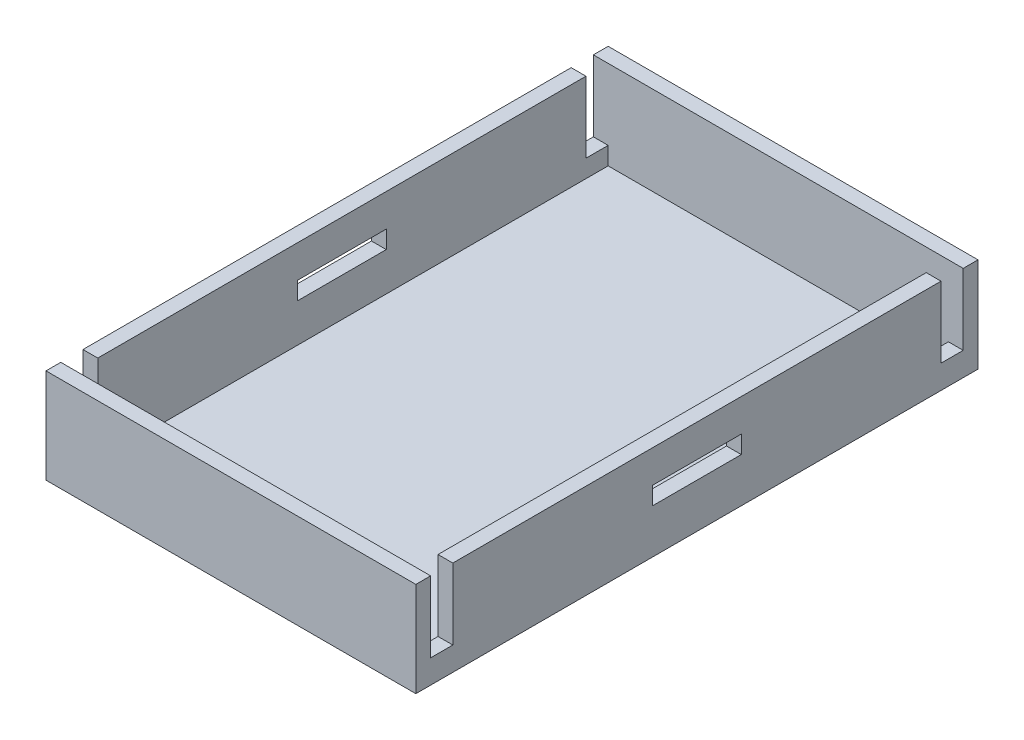
ISO-10303-21;
HEADER;
FILE_DESCRIPTION(('STEP AP214'),'2;1');
FILE_NAME('part.step','',(''),(''),'','','');
FILE_SCHEMA(('AUTOMOTIVE_DESIGN { 1 0 10303 214 1 1 1 1 }'));
ENDSEC;
DATA;
#1=APPLICATION_CONTEXT('core data for automotive mechanical design processes');
#2=APPLICATION_PROTOCOL_DEFINITION('international standard','automotive_design',2000,#1);
#3=PRODUCT_CONTEXT('',#1,'mechanical');
#4=PRODUCT('Part','Part','',(#3));
#5=PRODUCT_RELATED_PRODUCT_CATEGORY('part','',(#4));
#6=PRODUCT_DEFINITION_FORMATION('','',#4);
#7=PRODUCT_DEFINITION_CONTEXT('part definition',#1,'design');
#8=PRODUCT_DEFINITION('design','',#6,#7);
#9=PRODUCT_DEFINITION_SHAPE('','',#8);
#10=(LENGTH_UNIT() NAMED_UNIT(*) SI_UNIT(.MILLI.,.METRE.));
#11=(NAMED_UNIT(*) PLANE_ANGLE_UNIT() SI_UNIT($,.RADIAN.));
#12=(NAMED_UNIT(*) SI_UNIT($,.STERADIAN.) SOLID_ANGLE_UNIT());
#13=UNCERTAINTY_MEASURE_WITH_UNIT(LENGTH_MEASURE(1.E-05),#10,'distance_accuracy_value','');
#14=(GEOMETRIC_REPRESENTATION_CONTEXT(3) GLOBAL_UNCERTAINTY_ASSIGNED_CONTEXT((#13)) GLOBAL_UNIT_ASSIGNED_CONTEXT((#10,
#11,#12)) REPRESENTATION_CONTEXT('',''));
#15=CARTESIAN_POINT('',(0.,0.,0.));
#16=DIRECTION('',(0.,0.,1.));
#17=DIRECTION('',(1.,0.,0.));
#18=AXIS2_PLACEMENT_3D('',#15,#16,#17);
#19=CARTESIAN_POINT('',(12.5,6.4,19.));
#20=DIRECTION('',(-1.,0.,0.));
#21=DIRECTION('',(0.,0.,1.));
#22=AXIS2_PLACEMENT_3D('',#19,#20,#21);
#23=PLANE('',#22);
#24=DIRECTION('',(0.,0.,1.));
#25=VECTOR('',#24,1.);
#26=CARTESIAN_POINT('',(12.5,4.2,3.));
#27=LINE('',#26,#25);
#28=CARTESIAN_POINT('',(12.5,4.2,-3.));
#29=VERTEX_POINT('',#28);
#30=CARTESIAN_POINT('',(12.5,4.2,3.));
#31=VERTEX_POINT('',#30);
#32=EDGE_CURVE('E244',#29,#31,#27,.T.);
#33=ORIENTED_EDGE('',*,*,#32,.F.);
#34=DIRECTION('',(0.,1.,0.));
#35=VECTOR('',#34,1.);
#36=CARTESIAN_POINT('',(12.5,3.,-3.));
#37=LINE('',#36,#35);
#38=CARTESIAN_POINT('',(12.5,3.,-3.));
#39=VERTEX_POINT('',#38);
#40=EDGE_CURVE('E57',#39,#29,#37,.T.);
#41=ORIENTED_EDGE('',*,*,#40,.F.);
#42=DIRECTION('',(0.,0.,-1.));
#43=VECTOR('',#42,1.);
#44=CARTESIAN_POINT('',(12.5,3.,3.));
#45=LINE('',#44,#43);
#46=CARTESIAN_POINT('',(12.5,3.,3.));
#47=VERTEX_POINT('',#46);
#48=EDGE_CURVE('E251',#47,#39,#45,.T.);
#49=ORIENTED_EDGE('',*,*,#48,.F.);
#50=DIRECTION('',(0.,-1.,0.));
#51=VECTOR('',#50,1.);
#52=CARTESIAN_POINT('',(12.5,3.,3.));
#53=LINE('',#52,#51);
#54=EDGE_CURVE('E234',#31,#47,#53,.T.);
#55=ORIENTED_EDGE('',*,*,#54,.F.);
#56=EDGE_LOOP('',(#33,#41,#49,#55));
#57=FACE_BOUND('',#56,.T.);
#58=DIRECTION('',(0.,1.,0.));
#59=VECTOR('',#58,1.);
#60=CARTESIAN_POINT('',(12.5,1.6,-18.));
#61=LINE('',#60,#59);
#62=CARTESIAN_POINT('',(12.5,1.6,-18.));
#63=VERTEX_POINT('',#62);
#64=CARTESIAN_POINT('',(12.5,6.4,-18.));
#65=VERTEX_POINT('',#64);
#66=EDGE_CURVE('E322',#63,#65,#61,.T.);
#67=ORIENTED_EDGE('',*,*,#66,.F.);
#68=DIRECTION('',(0.,0.,-1.));
#69=VECTOR('',#68,1.);
#70=CARTESIAN_POINT('',(12.5,1.6,0.));
#71=LINE('',#70,#69);
#72=CARTESIAN_POINT('',(12.5,1.6,-16.5));
#73=VERTEX_POINT('',#72);
#74=EDGE_CURVE('E316',#73,#63,#71,.T.);
#75=ORIENTED_EDGE('',*,*,#74,.F.);
#76=DIRECTION('',(0.,1.,0.));
#77=VECTOR('',#76,1.);
#78=CARTESIAN_POINT('',(12.5,1.6,-16.5));
#79=LINE('',#78,#77);
#80=CARTESIAN_POINT('',(12.5,6.4,-16.5));
#81=VERTEX_POINT('',#80);
#82=EDGE_CURVE('E326',#73,#81,#79,.T.);
#83=ORIENTED_EDGE('',*,*,#82,.T.);
#84=DIRECTION('',(0.,0.,-1.));
#85=VECTOR('',#84,1.);
#86=CARTESIAN_POINT('',(12.5,6.4,19.));
#87=LINE('',#86,#85);
#88=CARTESIAN_POINT('',(12.5,6.4,16.5));
#89=VERTEX_POINT('',#88);
#90=EDGE_CURVE('E406',#89,#81,#87,.T.);
#91=ORIENTED_EDGE('',*,*,#90,.F.);
#92=DIRECTION('',(0.,1.,0.));
#93=VECTOR('',#92,1.);
#94=CARTESIAN_POINT('',(12.5,1.6,16.5));
#95=LINE('',#94,#93);
#96=CARTESIAN_POINT('',(12.5,1.6,16.5));
#97=VERTEX_POINT('',#96);
#98=EDGE_CURVE('E303',#97,#89,#95,.T.);
#99=ORIENTED_EDGE('',*,*,#98,.F.);
#100=DIRECTION('',(0.,0.,-1.));
#101=VECTOR('',#100,1.);
#102=CARTESIAN_POINT('',(12.5,1.6,0.));
#103=LINE('',#102,#101);
#104=CARTESIAN_POINT('',(12.5,1.6,18.));
#105=VERTEX_POINT('',#104);
#106=EDGE_CURVE('E291',#105,#97,#103,.T.);
#107=ORIENTED_EDGE('',*,*,#106,.F.);
#108=DIRECTION('',(0.,1.,0.));
#109=VECTOR('',#108,1.);
#110=CARTESIAN_POINT('',(12.5,1.6,18.));
#111=LINE('',#110,#109);
#112=CARTESIAN_POINT('',(12.5,6.4,18.));
#113=VERTEX_POINT('',#112);
#114=EDGE_CURVE('E296',#105,#113,#111,.T.);
#115=ORIENTED_EDGE('',*,*,#114,.T.);
#116=CARTESIAN_POINT('',(12.5,6.4,19.));
#117=VERTEX_POINT('',#116);
#118=EDGE_CURVE('E402',#117,#113,#87,.T.);
#119=ORIENTED_EDGE('',*,*,#118,.F.);
#120=DIRECTION('',(0.,-1.,0.));
#121=VECTOR('',#120,1.);
#122=CARTESIAN_POINT('',(12.5,6.4,19.));
#123=LINE('',#122,#121);
#124=CARTESIAN_POINT('',(12.5,0.,19.));
#125=VERTEX_POINT('',#124);
#126=EDGE_CURVE('E416',#117,#125,#123,.T.);
#127=ORIENTED_EDGE('',*,*,#126,.T.);
#128=DIRECTION('',(0.,0.,-1.));
#129=VECTOR('',#128,1.);
#130=CARTESIAN_POINT('',(12.5,0.,19.));
#131=LINE('',#130,#129);
#132=CARTESIAN_POINT('',(12.5,0.,-19.));
#133=VERTEX_POINT('',#132);
#134=EDGE_CURVE('E393',#125,#133,#131,.T.);
#135=ORIENTED_EDGE('',*,*,#134,.T.);
#136=DIRECTION('',(0.,-1.,0.));
#137=VECTOR('',#136,1.);
#138=CARTESIAN_POINT('',(12.5,6.4,-19.));
#139=LINE('',#138,#137);
#140=CARTESIAN_POINT('',(12.5,6.4,-19.));
#141=VERTEX_POINT('',#140);
#142=EDGE_CURVE('E433',#141,#133,#139,.T.);
#143=ORIENTED_EDGE('',*,*,#142,.F.);
#144=EDGE_CURVE('E407',#65,#141,#87,.T.);
#145=ORIENTED_EDGE('',*,*,#144,.F.);
#146=EDGE_LOOP('',(#67,#75,#83,#91,#99,#107,#115,#119,#127,#135,#143,#145));
#147=FACE_BOUND('',#146,.T.);
#148=ADVANCED_FACE('F43',(#57,#147),#23,.F.);
#149=CARTESIAN_POINT('',(-12.5,6.4,19.));
#150=DIRECTION('',(1.,0.,0.));
#151=DIRECTION('',(0.,0.,-1.));
#152=AXIS2_PLACEMENT_3D('',#149,#150,#151);
#153=PLANE('',#152);
#154=DIRECTION('',(0.,0.,-1.));
#155=VECTOR('',#154,1.);
#156=CARTESIAN_POINT('',(-12.5,3.,3.));
#157=LINE('',#156,#155);
#158=CARTESIAN_POINT('',(-12.5,3.,3.));
#159=VERTEX_POINT('',#158);
#160=CARTESIAN_POINT('',(-12.5,3.,-3.));
#161=VERTEX_POINT('',#160);
#162=EDGE_CURVE('E263',#159,#161,#157,.T.);
#163=ORIENTED_EDGE('',*,*,#162,.T.);
#164=DIRECTION('',(0.,1.,0.));
#165=VECTOR('',#164,1.);
#166=CARTESIAN_POINT('',(-12.5,3.,-3.));
#167=LINE('',#166,#165);
#168=CARTESIAN_POINT('',(-12.5,4.2,-3.));
#169=VERTEX_POINT('',#168);
#170=EDGE_CURVE('E253',#161,#169,#167,.T.);
#171=ORIENTED_EDGE('',*,*,#170,.T.);
#172=DIRECTION('',(0.,0.,1.));
#173=VECTOR('',#172,1.);
#174=CARTESIAN_POINT('',(-12.5,4.2,3.));
#175=LINE('',#174,#173);
#176=CARTESIAN_POINT('',(-12.5,4.2,3.));
#177=VERTEX_POINT('',#176);
#178=EDGE_CURVE('E259',#169,#177,#175,.T.);
#179=ORIENTED_EDGE('',*,*,#178,.T.);
#180=DIRECTION('',(0.,-1.,0.));
#181=VECTOR('',#180,1.);
#182=CARTESIAN_POINT('',(-12.5,3.,3.));
#183=LINE('',#182,#181);
#184=EDGE_CURVE('E65',#177,#159,#183,.T.);
#185=ORIENTED_EDGE('',*,*,#184,.T.);
#186=EDGE_LOOP('',(#163,#171,#179,#185));
#187=FACE_BOUND('',#186,.T.);
#188=DIRECTION('',(0.,1.,0.));
#189=VECTOR('',#188,1.);
#190=CARTESIAN_POINT('',(-12.5,1.6,18.));
#191=LINE('',#190,#189);
#192=CARTESIAN_POINT('',(-12.5,1.6,18.));
#193=VERTEX_POINT('',#192);
#194=CARTESIAN_POINT('',(-12.5,6.4,18.));
#195=VERTEX_POINT('',#194);
#196=EDGE_CURVE('E321',#193,#195,#191,.T.);
#197=ORIENTED_EDGE('',*,*,#196,.F.);
#198=DIRECTION('',(0.,0.,1.));
#199=VECTOR('',#198,1.);
#200=CARTESIAN_POINT('',(-12.5,1.6,0.));
#201=LINE('',#200,#199);
#202=CARTESIAN_POINT('',(-12.5,1.6,16.5));
#203=VERTEX_POINT('',#202);
#204=EDGE_CURVE('E338',#203,#193,#201,.T.);
#205=ORIENTED_EDGE('',*,*,#204,.F.);
#206=DIRECTION('',(0.,1.,0.));
#207=VECTOR('',#206,1.);
#208=CARTESIAN_POINT('',(-12.5,1.6,16.5));
#209=LINE('',#208,#207);
#210=CARTESIAN_POINT('',(-12.5,6.4,16.5));
#211=VERTEX_POINT('',#210);
#212=EDGE_CURVE('E345',#203,#211,#209,.T.);
#213=ORIENTED_EDGE('',*,*,#212,.T.);
#214=DIRECTION('',(0.,0.,1.));
#215=VECTOR('',#214,1.);
#216=CARTESIAN_POINT('',(-12.5,6.4,19.));
#217=LINE('',#216,#215);
#218=CARTESIAN_POINT('',(-12.5,6.4,-16.5));
#219=VERTEX_POINT('',#218);
#220=EDGE_CURVE('E414',#219,#211,#217,.T.);
#221=ORIENTED_EDGE('',*,*,#220,.F.);
#222=DIRECTION('',(0.,1.,0.));
#223=VECTOR('',#222,1.);
#224=CARTESIAN_POINT('',(-12.5,1.6,-16.5));
#225=LINE('',#224,#223);
#226=CARTESIAN_POINT('',(-12.5,1.6,-16.5));
#227=VERTEX_POINT('',#226);
#228=EDGE_CURVE('E362',#227,#219,#225,.T.);
#229=ORIENTED_EDGE('',*,*,#228,.F.);
#230=DIRECTION('',(0.,0.,1.));
#231=VECTOR('',#230,1.);
#232=CARTESIAN_POINT('',(-12.5,1.6,0.));
#233=LINE('',#232,#231);
#234=CARTESIAN_POINT('',(-12.5,1.6,-18.));
#235=VERTEX_POINT('',#234);
#236=EDGE_CURVE('E356',#235,#227,#233,.T.);
#237=ORIENTED_EDGE('',*,*,#236,.F.);
#238=DIRECTION('',(0.,1.,0.));
#239=VECTOR('',#238,1.);
#240=CARTESIAN_POINT('',(-12.5,1.6,-18.));
#241=LINE('',#240,#239);
#242=CARTESIAN_POINT('',(-12.5,6.4,-18.));
#243=VERTEX_POINT('',#242);
#244=EDGE_CURVE('E365',#235,#243,#241,.T.);
#245=ORIENTED_EDGE('',*,*,#244,.T.);
#246=CARTESIAN_POINT('',(-12.5,6.4,-19.));
#247=VERTEX_POINT('',#246);
#248=EDGE_CURVE('E410',#247,#243,#217,.T.);
#249=ORIENTED_EDGE('',*,*,#248,.F.);
#250=DIRECTION('',(0.,-1.,0.));
#251=VECTOR('',#250,1.);
#252=CARTESIAN_POINT('',(-12.5,6.4,-19.));
#253=LINE('',#252,#251);
#254=CARTESIAN_POINT('',(-12.5,0.,-19.));
#255=VERTEX_POINT('',#254);
#256=EDGE_CURVE('E430',#247,#255,#253,.T.);
#257=ORIENTED_EDGE('',*,*,#256,.T.);
#258=DIRECTION('',(0.,0.,1.));
#259=VECTOR('',#258,1.);
#260=CARTESIAN_POINT('',(-12.5,0.,19.));
#261=LINE('',#260,#259);
#262=CARTESIAN_POINT('',(-12.5,0.,19.));
#263=VERTEX_POINT('',#262);
#264=EDGE_CURVE('E421',#255,#263,#261,.T.);
#265=ORIENTED_EDGE('',*,*,#264,.T.);
#266=DIRECTION('',(0.,-1.,0.));
#267=VECTOR('',#266,1.);
#268=CARTESIAN_POINT('',(-12.5,6.4,19.));
#269=LINE('',#268,#267);
#270=CARTESIAN_POINT('',(-12.5,6.4,19.));
#271=VERTEX_POINT('',#270);
#272=EDGE_CURVE('E427',#271,#263,#269,.T.);
#273=ORIENTED_EDGE('',*,*,#272,.F.);
#274=EDGE_CURVE('E409',#195,#271,#217,.T.);
#275=ORIENTED_EDGE('',*,*,#274,.F.);
#276=EDGE_LOOP('',(#197,#205,#213,#221,#229,#237,#245,#249,#257,#265,#273,#275));
#277=FACE_BOUND('',#276,.T.);
#278=ADVANCED_FACE('F459',(#187,#277),#153,.F.);
#279=CARTESIAN_POINT('',(0.,6.4,0.));
#280=DIRECTION('',(0.,-1.,0.));
#281=DIRECTION('',(0.,0.,-1.));
#282=AXIS2_PLACEMENT_3D('',#279,#280,#281);
#283=PLANE('',#282);
#284=DIRECTION('',(1.,0.,0.));
#285=VECTOR('',#284,1.);
#286=CARTESIAN_POINT('',(0.,6.4,-18.));
#287=LINE('',#286,#285);
#288=EDGE_CURVE('E386',#243,#65,#287,.T.);
#289=ORIENTED_EDGE('',*,*,#288,.T.);
#290=ORIENTED_EDGE('',*,*,#144,.T.);
#291=DIRECTION('',(-1.,0.,0.));
#292=VECTOR('',#291,1.);
#293=CARTESIAN_POINT('',(-12.5,6.4,-19.));
#294=LINE('',#293,#292);
#295=EDGE_CURVE('E405',#141,#247,#294,.T.);
#296=ORIENTED_EDGE('',*,*,#295,.T.);
#297=ORIENTED_EDGE('',*,*,#248,.T.);
#298=EDGE_LOOP('',(#289,#290,#296,#297));
#299=FACE_BOUND('',#298,.T.);
#300=ADVANCED_FACE('F464',(#299),#283,.F.);
#301=DIRECTION('',(1.,0.,0.));
#302=VECTOR('',#301,1.);
#303=CARTESIAN_POINT('',(0.,6.4,18.));
#304=LINE('',#303,#302);
#305=EDGE_CURVE('E364',#195,#113,#304,.T.);
#306=ORIENTED_EDGE('',*,*,#305,.F.);
#307=ORIENTED_EDGE('',*,*,#274,.T.);
#308=DIRECTION('',(1.,0.,0.));
#309=VECTOR('',#308,1.);
#310=CARTESIAN_POINT('',(-12.5,6.4,19.));
#311=LINE('',#310,#309);
#312=EDGE_CURVE('E413',#271,#117,#311,.T.);
#313=ORIENTED_EDGE('',*,*,#312,.T.);
#314=ORIENTED_EDGE('',*,*,#118,.T.);
#315=EDGE_LOOP('',(#306,#307,#313,#314));
#316=FACE_BOUND('',#315,.T.);
#317=ADVANCED_FACE('F471',(#316),#283,.F.);
#318=ORIENTED_EDGE('',*,*,#90,.T.);
#319=DIRECTION('',(1.,0.,0.));
#320=VECTOR('',#319,1.);
#321=CARTESIAN_POINT('',(0.,6.4,-16.5));
#322=LINE('',#321,#320);
#323=CARTESIAN_POINT('',(11.5,6.4,-16.5));
#324=VERTEX_POINT('',#323);
#325=EDGE_CURVE('E310',#324,#81,#322,.T.);
#326=ORIENTED_EDGE('',*,*,#325,.F.);
#327=DIRECTION('',(0.,0.,-1.));
#328=VECTOR('',#327,1.);
#329=CARTESIAN_POINT('',(11.5,6.4,0.));
#330=LINE('',#329,#328);
#331=CARTESIAN_POINT('',(11.5,6.4,16.5));
#332=VERTEX_POINT('',#331);
#333=EDGE_CURVE('E383',#332,#324,#330,.T.);
#334=ORIENTED_EDGE('',*,*,#333,.F.);
#335=DIRECTION('',(1.,0.,0.));
#336=VECTOR('',#335,1.);
#337=CARTESIAN_POINT('',(0.,6.4,16.5));
#338=LINE('',#337,#336);
#339=EDGE_CURVE('E284',#332,#89,#338,.T.);
#340=ORIENTED_EDGE('',*,*,#339,.T.);
#341=EDGE_LOOP('',(#318,#326,#334,#340));
#342=FACE_BOUND('',#341,.T.);
#343=ADVANCED_FACE('F536',(#342),#283,.F.);
#344=ORIENTED_EDGE('',*,*,#220,.T.);
#345=DIRECTION('',(-1.,0.,0.));
#346=VECTOR('',#345,1.);
#347=CARTESIAN_POINT('',(0.,6.4,16.5));
#348=LINE('',#347,#346);
#349=CARTESIAN_POINT('',(-11.5,6.4,16.5));
#350=VERTEX_POINT('',#349);
#351=EDGE_CURVE('E302',#350,#211,#348,.T.);
#352=ORIENTED_EDGE('',*,*,#351,.F.);
#353=DIRECTION('',(0.,0.,-1.));
#354=VECTOR('',#353,1.);
#355=CARTESIAN_POINT('',(-11.5,6.4,0.));
#356=LINE('',#355,#354);
#357=CARTESIAN_POINT('',(-11.5,6.4,-16.5));
#358=VERTEX_POINT('',#357);
#359=EDGE_CURVE('E374',#350,#358,#356,.T.);
#360=ORIENTED_EDGE('',*,*,#359,.T.);
#361=DIRECTION('',(-1.,0.,0.));
#362=VECTOR('',#361,1.);
#363=CARTESIAN_POINT('',(0.,6.4,-16.5));
#364=LINE('',#363,#362);
#365=EDGE_CURVE('E325',#358,#219,#364,.T.);
#366=ORIENTED_EDGE('',*,*,#365,.T.);
#367=EDGE_LOOP('',(#344,#352,#360,#366));
#368=FACE_BOUND('',#367,.T.);
#369=ADVANCED_FACE('F474',(#368),#283,.F.);
#370=CARTESIAN_POINT('',(-11.5,0.4,0.));
#371=DIRECTION('',(1.,0.,0.));
#372=DIRECTION('',(0.,0.,-1.));
#373=AXIS2_PLACEMENT_3D('',#370,#371,#372);
#374=PLANE('',#373);
#375=DIRECTION('',(0.,1.,0.));
#376=VECTOR('',#375,1.);
#377=CARTESIAN_POINT('',(-11.5,0.4,-3.));
#378=LINE('',#377,#376);
#379=CARTESIAN_POINT('',(-11.5,3.,-3.));
#380=VERTEX_POINT('',#379);
#381=CARTESIAN_POINT('',(-11.5,4.2,-3.));
#382=VERTEX_POINT('',#381);
#383=EDGE_CURVE('E281',#380,#382,#378,.T.);
#384=ORIENTED_EDGE('',*,*,#383,.F.);
#385=DIRECTION('',(0.,0.,-1.));
#386=VECTOR('',#385,1.);
#387=CARTESIAN_POINT('',(-11.5,3.,0.));
#388=LINE('',#387,#386);
#389=CARTESIAN_POINT('',(-11.5,3.,3.));
#390=VERTEX_POINT('',#389);
#391=EDGE_CURVE('E279',#390,#380,#388,.T.);
#392=ORIENTED_EDGE('',*,*,#391,.F.);
#393=DIRECTION('',(0.,-1.,0.));
#394=VECTOR('',#393,1.);
#395=CARTESIAN_POINT('',(-11.5,0.399999999999999,3.));
#396=LINE('',#395,#394);
#397=CARTESIAN_POINT('',(-11.5,4.2,3.));
#398=VERTEX_POINT('',#397);
#399=EDGE_CURVE('E277',#398,#390,#396,.T.);
#400=ORIENTED_EDGE('',*,*,#399,.F.);
#401=DIRECTION('',(0.,0.,1.));
#402=VECTOR('',#401,1.);
#403=CARTESIAN_POINT('',(-11.5,4.2,0.));
#404=LINE('',#403,#402);
#405=EDGE_CURVE('E269',#382,#398,#404,.T.);
#406=ORIENTED_EDGE('',*,*,#405,.F.);
#407=EDGE_LOOP('',(#384,#392,#400,#406));
#408=FACE_BOUND('',#407,.T.);
#409=DIRECTION('',(0.,1.,0.));
#410=VECTOR('',#409,1.);
#411=CARTESIAN_POINT('',(-11.5,1.6,16.5));
#412=LINE('',#411,#410);
#413=CARTESIAN_POINT('',(-11.5,1.6,16.5));
#414=VERTEX_POINT('',#413);
#415=EDGE_CURVE('E341',#414,#350,#412,.T.);
#416=ORIENTED_EDGE('',*,*,#415,.F.);
#417=DIRECTION('',(0.,0.,-1.));
#418=VECTOR('',#417,1.);
#419=CARTESIAN_POINT('',(-11.5,1.6,0.));
#420=LINE('',#419,#418);
#421=CARTESIAN_POINT('',(-11.5,1.6,18.));
#422=VERTEX_POINT('',#421);
#423=EDGE_CURVE('E332',#422,#414,#420,.T.);
#424=ORIENTED_EDGE('',*,*,#423,.F.);
#425=DIRECTION('',(0.,1.,0.));
#426=VECTOR('',#425,1.);
#427=CARTESIAN_POINT('',(-11.5,0.4,18.));
#428=LINE('',#427,#426);
#429=CARTESIAN_POINT('',(-11.5,0.4,18.));
#430=VERTEX_POINT('',#429);
#431=EDGE_CURVE('E390',#430,#422,#428,.T.);
#432=ORIENTED_EDGE('',*,*,#431,.F.);
#433=DIRECTION('',(0.,0.,-1.));
#434=VECTOR('',#433,1.);
#435=CARTESIAN_POINT('',(-11.5,0.4,0.));
#436=LINE('',#435,#434);
#437=CARTESIAN_POINT('',(-11.5,0.4,-18.));
#438=VERTEX_POINT('',#437);
#439=EDGE_CURVE('E379',#430,#438,#436,.T.);
#440=ORIENTED_EDGE('',*,*,#439,.T.);
#441=DIRECTION('',(0.,1.,0.));
#442=VECTOR('',#441,1.);
#443=CARTESIAN_POINT('',(-11.5,0.4,-18.));
#444=LINE('',#443,#442);
#445=CARTESIAN_POINT('',(-11.5,1.6,-18.));
#446=VERTEX_POINT('',#445);
#447=EDGE_CURVE('E394',#438,#446,#444,.T.);
#448=ORIENTED_EDGE('',*,*,#447,.T.);
#449=DIRECTION('',(0.,0.,-1.));
#450=VECTOR('',#449,1.);
#451=CARTESIAN_POINT('',(-11.5,1.6,0.));
#452=LINE('',#451,#450);
#453=CARTESIAN_POINT('',(-11.5,1.6,-16.5));
#454=VERTEX_POINT('',#453);
#455=EDGE_CURVE('E351',#454,#446,#452,.T.);
#456=ORIENTED_EDGE('',*,*,#455,.F.);
#457=DIRECTION('',(0.,1.,0.));
#458=VECTOR('',#457,1.);
#459=CARTESIAN_POINT('',(-11.5,1.6,-16.5));
#460=LINE('',#459,#458);
#461=EDGE_CURVE('E359',#454,#358,#460,.T.);
#462=ORIENTED_EDGE('',*,*,#461,.T.);
#463=ORIENTED_EDGE('',*,*,#359,.F.);
#464=EDGE_LOOP('',(#416,#424,#432,#440,#448,#456,#462,#463));
#465=FACE_BOUND('',#464,.T.);
#466=ADVANCED_FACE('F488',(#408,#465),#374,.T.);
#467=CARTESIAN_POINT('',(11.5,0.4,0.));
#468=DIRECTION('',(1.,0.,0.));
#469=DIRECTION('',(0.,0.,-1.));
#470=AXIS2_PLACEMENT_3D('',#467,#468,#469);
#471=PLANE('',#470);
#472=DIRECTION('',(0.,0.,-1.));
#473=VECTOR('',#472,1.);
#474=CARTESIAN_POINT('',(11.5,3.,0.));
#475=LINE('',#474,#473);
#476=CARTESIAN_POINT('',(11.5,3.,3.));
#477=VERTEX_POINT('',#476);
#478=CARTESIAN_POINT('',(11.5,3.,-3.));
#479=VERTEX_POINT('',#478);
#480=EDGE_CURVE('E50',#477,#479,#475,.T.);
#481=ORIENTED_EDGE('',*,*,#480,.T.);
#482=DIRECTION('',(0.,1.,0.));
#483=VECTOR('',#482,1.);
#484=CARTESIAN_POINT('',(11.5,0.4,-3.));
#485=LINE('',#484,#483);
#486=CARTESIAN_POINT('',(11.5,4.2,-3.));
#487=VERTEX_POINT('',#486);
#488=EDGE_CURVE('E11',#479,#487,#485,.T.);
#489=ORIENTED_EDGE('',*,*,#488,.T.);
#490=DIRECTION('',(0.,0.,1.));
#491=VECTOR('',#490,1.);
#492=CARTESIAN_POINT('',(11.5,4.2,0.));
#493=LINE('',#492,#491);
#494=CARTESIAN_POINT('',(11.5,4.2,3.));
#495=VERTEX_POINT('',#494);
#496=EDGE_CURVE('E436',#487,#495,#493,.T.);
#497=ORIENTED_EDGE('',*,*,#496,.T.);
#498=DIRECTION('',(0.,-1.,0.));
#499=VECTOR('',#498,1.);
#500=CARTESIAN_POINT('',(11.5,0.399999999999999,3.));
#501=LINE('',#500,#499);
#502=EDGE_CURVE('E237',#495,#477,#501,.T.);
#503=ORIENTED_EDGE('',*,*,#502,.T.);
#504=EDGE_LOOP('',(#481,#489,#497,#503));
#505=FACE_BOUND('',#504,.T.);
#506=ORIENTED_EDGE('',*,*,#333,.T.);
#507=DIRECTION('',(0.,1.,0.));
#508=VECTOR('',#507,1.);
#509=CARTESIAN_POINT('',(11.5,1.6,-16.5));
#510=LINE('',#509,#508);
#511=CARTESIAN_POINT('',(11.5,1.6,-16.5));
#512=VERTEX_POINT('',#511);
#513=EDGE_CURVE('E319',#512,#324,#510,.T.);
#514=ORIENTED_EDGE('',*,*,#513,.F.);
#515=DIRECTION('',(0.,0.,-1.));
#516=VECTOR('',#515,1.);
#517=CARTESIAN_POINT('',(11.5,1.6,0.));
#518=LINE('',#517,#516);
#519=CARTESIAN_POINT('',(11.5,1.6,-18.));
#520=VERTEX_POINT('',#519);
#521=EDGE_CURVE('E309',#512,#520,#518,.T.);
#522=ORIENTED_EDGE('',*,*,#521,.T.);
#523=DIRECTION('',(0.,1.,0.));
#524=VECTOR('',#523,1.);
#525=CARTESIAN_POINT('',(11.5,0.4,-18.));
#526=LINE('',#525,#524);
#527=CARTESIAN_POINT('',(11.5,0.4,-18.));
#528=VERTEX_POINT('',#527);
#529=EDGE_CURVE('E397',#528,#520,#526,.T.);
#530=ORIENTED_EDGE('',*,*,#529,.F.);
#531=DIRECTION('',(0.,0.,-1.));
#532=VECTOR('',#531,1.);
#533=CARTESIAN_POINT('',(11.5,0.4,0.));
#534=LINE('',#533,#532);
#535=CARTESIAN_POINT('',(11.5,0.4,18.));
#536=VERTEX_POINT('',#535);
#537=EDGE_CURVE('E373',#536,#528,#534,.T.);
#538=ORIENTED_EDGE('',*,*,#537,.F.);
#539=DIRECTION('',(0.,1.,0.));
#540=VECTOR('',#539,1.);
#541=CARTESIAN_POINT('',(11.5,0.4,18.));
#542=LINE('',#541,#540);
#543=CARTESIAN_POINT('',(11.5,1.6,18.));
#544=VERTEX_POINT('',#543);
#545=EDGE_CURVE('E381',#536,#544,#542,.T.);
#546=ORIENTED_EDGE('',*,*,#545,.T.);
#547=DIRECTION('',(0.,0.,-1.));
#548=VECTOR('',#547,1.);
#549=CARTESIAN_POINT('',(11.5,1.6,0.));
#550=LINE('',#549,#548);
#551=CARTESIAN_POINT('',(11.5,1.6,16.5));
#552=VERTEX_POINT('',#551);
#553=EDGE_CURVE('E285',#544,#552,#550,.T.);
#554=ORIENTED_EDGE('',*,*,#553,.T.);
#555=DIRECTION('',(0.,1.,0.));
#556=VECTOR('',#555,1.);
#557=CARTESIAN_POINT('',(11.5,1.6,16.5));
#558=LINE('',#557,#556);
#559=EDGE_CURVE('E299',#552,#332,#558,.T.);
#560=ORIENTED_EDGE('',*,*,#559,.T.);
#561=EDGE_LOOP('',(#506,#514,#522,#530,#538,#546,#554,#560));
#562=FACE_BOUND('',#561,.T.);
#563=ADVANCED_FACE('F440',(#505,#562),#471,.F.);
#564=CARTESIAN_POINT('',(-12.5,6.4,-19.));
#565=DIRECTION('',(0.,0.,1.));
#566=DIRECTION('',(1.,0.,0.));
#567=AXIS2_PLACEMENT_3D('',#564,#565,#566);
#568=PLANE('',#567);
#569=DIRECTION('',(-1.,0.,0.));
#570=VECTOR('',#569,1.);
#571=CARTESIAN_POINT('',(-12.5,0.,-19.));
#572=LINE('',#571,#570);
#573=EDGE_CURVE('E419',#133,#255,#572,.T.);
#574=ORIENTED_EDGE('',*,*,#573,.T.);
#575=ORIENTED_EDGE('',*,*,#256,.F.);
#576=ORIENTED_EDGE('',*,*,#295,.F.);
#577=ORIENTED_EDGE('',*,*,#142,.T.);
#578=EDGE_LOOP('',(#574,#575,#576,#577));
#579=FACE_BOUND('',#578,.T.);
#580=ADVANCED_FACE('F479',(#579),#568,.F.);
#581=CARTESIAN_POINT('',(-12.5,6.4,19.));
#582=DIRECTION('',(0.,0.,-1.));
#583=DIRECTION('',(-1.,0.,0.));
#584=AXIS2_PLACEMENT_3D('',#581,#582,#583);
#585=PLANE('',#584);
#586=DIRECTION('',(1.,0.,0.));
#587=VECTOR('',#586,1.);
#588=CARTESIAN_POINT('',(-12.5,0.,19.));
#589=LINE('',#588,#587);
#590=EDGE_CURVE('E423',#263,#125,#589,.T.);
#591=ORIENTED_EDGE('',*,*,#590,.T.);
#592=ORIENTED_EDGE('',*,*,#126,.F.);
#593=ORIENTED_EDGE('',*,*,#312,.F.);
#594=ORIENTED_EDGE('',*,*,#272,.T.);
#595=EDGE_LOOP('',(#591,#592,#593,#594));
#596=FACE_BOUND('',#595,.T.);
#597=ADVANCED_FACE('F477',(#596),#585,.F.);
#598=CARTESIAN_POINT('',(0.,0.,0.));
#599=DIRECTION('',(0.,-1.,0.));
#600=DIRECTION('',(0.,0.,-1.));
#601=AXIS2_PLACEMENT_3D('',#598,#599,#600);
#602=PLANE('',#601);
#603=ORIENTED_EDGE('',*,*,#134,.F.);
#604=ORIENTED_EDGE('',*,*,#590,.F.);
#605=ORIENTED_EDGE('',*,*,#264,.F.);
#606=ORIENTED_EDGE('',*,*,#573,.F.);
#607=EDGE_LOOP('',(#603,#604,#605,#606));
#608=FACE_BOUND('',#607,.T.);
#609=ADVANCED_FACE('F485',(#608),#602,.T.);
#610=CARTESIAN_POINT('',(0.,0.4,18.));
#611=DIRECTION('',(0.,0.,1.));
#612=DIRECTION('',(1.,0.,0.));
#613=AXIS2_PLACEMENT_3D('',#610,#611,#612);
#614=PLANE('',#613);
#615=ORIENTED_EDGE('',*,*,#305,.T.);
#616=ORIENTED_EDGE('',*,*,#114,.F.);
#617=DIRECTION('',(1.,0.,0.));
#618=VECTOR('',#617,1.);
#619=CARTESIAN_POINT('',(0.,1.6,18.));
#620=LINE('',#619,#618);
#621=EDGE_CURVE('E288',#544,#105,#620,.T.);
#622=ORIENTED_EDGE('',*,*,#621,.F.);
#623=ORIENTED_EDGE('',*,*,#545,.F.);
#624=DIRECTION('',(1.,0.,0.));
#625=VECTOR('',#624,1.);
#626=CARTESIAN_POINT('',(0.,0.4,18.));
#627=LINE('',#626,#625);
#628=EDGE_CURVE('E370',#430,#536,#627,.T.);
#629=ORIENTED_EDGE('',*,*,#628,.F.);
#630=ORIENTED_EDGE('',*,*,#431,.T.);
#631=DIRECTION('',(-1.,0.,0.));
#632=VECTOR('',#631,1.);
#633=CARTESIAN_POINT('',(0.,1.6,18.));
#634=LINE('',#633,#632);
#635=EDGE_CURVE('E330',#422,#193,#634,.T.);
#636=ORIENTED_EDGE('',*,*,#635,.T.);
#637=ORIENTED_EDGE('',*,*,#196,.T.);
#638=EDGE_LOOP('',(#615,#616,#622,#623,#629,#630,#636,#637));
#639=FACE_BOUND('',#638,.T.);
#640=ADVANCED_FACE('F556',(#639),#614,.F.);
#641=CARTESIAN_POINT('',(0.,0.4,-18.));
#642=DIRECTION('',(0.,0.,1.));
#643=DIRECTION('',(1.,0.,0.));
#644=AXIS2_PLACEMENT_3D('',#641,#642,#643);
#645=PLANE('',#644);
#646=ORIENTED_EDGE('',*,*,#288,.F.);
#647=ORIENTED_EDGE('',*,*,#244,.F.);
#648=DIRECTION('',(-1.,0.,0.));
#649=VECTOR('',#648,1.);
#650=CARTESIAN_POINT('',(0.,1.6,-18.));
#651=LINE('',#650,#649);
#652=EDGE_CURVE('E353',#446,#235,#651,.T.);
#653=ORIENTED_EDGE('',*,*,#652,.F.);
#654=ORIENTED_EDGE('',*,*,#447,.F.);
#655=DIRECTION('',(1.,0.,0.));
#656=VECTOR('',#655,1.);
#657=CARTESIAN_POINT('',(0.,0.4,-18.));
#658=LINE('',#657,#656);
#659=EDGE_CURVE('E377',#438,#528,#658,.T.);
#660=ORIENTED_EDGE('',*,*,#659,.T.);
#661=ORIENTED_EDGE('',*,*,#529,.T.);
#662=DIRECTION('',(1.,0.,0.));
#663=VECTOR('',#662,1.);
#664=CARTESIAN_POINT('',(0.,1.6,-18.));
#665=LINE('',#664,#663);
#666=EDGE_CURVE('E307',#520,#63,#665,.T.);
#667=ORIENTED_EDGE('',*,*,#666,.T.);
#668=ORIENTED_EDGE('',*,*,#66,.T.);
#669=EDGE_LOOP('',(#646,#647,#653,#654,#660,#661,#667,#668));
#670=FACE_BOUND('',#669,.T.);
#671=ADVANCED_FACE('F547',(#670),#645,.T.);
#672=CARTESIAN_POINT('',(0.,0.4,0.));
#673=DIRECTION('',(0.,1.,0.));
#674=DIRECTION('',(0.,0.,1.));
#675=AXIS2_PLACEMENT_3D('',#672,#673,#674);
#676=PLANE('',#675);
#677=ORIENTED_EDGE('',*,*,#628,.T.);
#678=ORIENTED_EDGE('',*,*,#537,.T.);
#679=ORIENTED_EDGE('',*,*,#659,.F.);
#680=ORIENTED_EDGE('',*,*,#439,.F.);
#681=EDGE_LOOP('',(#677,#678,#679,#680));
#682=FACE_BOUND('',#681,.T.);
#683=ADVANCED_FACE('F552',(#682),#676,.T.);
#684=CARTESIAN_POINT('',(0.,1.6,16.5));
#685=DIRECTION('',(0.,0.,1.));
#686=DIRECTION('',(1.,0.,0.));
#687=AXIS2_PLACEMENT_3D('',#684,#685,#686);
#688=PLANE('',#687);
#689=ORIENTED_EDGE('',*,*,#339,.F.);
#690=ORIENTED_EDGE('',*,*,#559,.F.);
#691=DIRECTION('',(1.,0.,0.));
#692=VECTOR('',#691,1.);
#693=CARTESIAN_POINT('',(0.,1.6,16.5));
#694=LINE('',#693,#692);
#695=EDGE_CURVE('E294',#552,#97,#694,.T.);
#696=ORIENTED_EDGE('',*,*,#695,.T.);
#697=ORIENTED_EDGE('',*,*,#98,.T.);
#698=EDGE_LOOP('',(#689,#690,#696,#697));
#699=FACE_BOUND('',#698,.T.);
#700=ADVANCED_FACE('F561',(#699),#688,.T.);
#701=CARTESIAN_POINT('',(0.,1.6,0.));
#702=DIRECTION('',(0.,1.,0.));
#703=DIRECTION('',(0.,0.,1.));
#704=AXIS2_PLACEMENT_3D('',#701,#702,#703);
#705=PLANE('',#704);
#706=ORIENTED_EDGE('',*,*,#553,.F.);
#707=ORIENTED_EDGE('',*,*,#621,.T.);
#708=ORIENTED_EDGE('',*,*,#106,.T.);
#709=ORIENTED_EDGE('',*,*,#695,.F.);
#710=EDGE_LOOP('',(#706,#707,#708,#709));
#711=FACE_BOUND('',#710,.T.);
#712=ADVANCED_FACE('F558',(#711),#705,.T.);
#713=CARTESIAN_POINT('',(0.,1.6,-16.5));
#714=DIRECTION('',(0.,0.,1.));
#715=DIRECTION('',(1.,0.,0.));
#716=AXIS2_PLACEMENT_3D('',#713,#714,#715);
#717=PLANE('',#716);
#718=ORIENTED_EDGE('',*,*,#325,.T.);
#719=ORIENTED_EDGE('',*,*,#82,.F.);
#720=DIRECTION('',(1.,0.,0.));
#721=VECTOR('',#720,1.);
#722=CARTESIAN_POINT('',(0.,1.6,-16.5));
#723=LINE('',#722,#721);
#724=EDGE_CURVE('E313',#512,#73,#723,.T.);
#725=ORIENTED_EDGE('',*,*,#724,.F.);
#726=ORIENTED_EDGE('',*,*,#513,.T.);
#727=EDGE_LOOP('',(#718,#719,#725,#726));
#728=FACE_BOUND('',#727,.T.);
#729=ADVANCED_FACE('F541',(#728),#717,.F.);
#730=CARTESIAN_POINT('',(0.,1.6,0.));
#731=DIRECTION('',(0.,1.,0.));
#732=DIRECTION('',(0.,0.,1.));
#733=AXIS2_PLACEMENT_3D('',#730,#731,#732);
#734=PLANE('',#733);
#735=ORIENTED_EDGE('',*,*,#666,.F.);
#736=ORIENTED_EDGE('',*,*,#521,.F.);
#737=ORIENTED_EDGE('',*,*,#724,.T.);
#738=ORIENTED_EDGE('',*,*,#74,.T.);
#739=EDGE_LOOP('',(#735,#736,#737,#738));
#740=FACE_BOUND('',#739,.T.);
#741=ADVANCED_FACE('F544',(#740),#734,.T.);
#742=CARTESIAN_POINT('',(0.,1.6,-16.5));
#743=DIRECTION('',(0.,0.,-1.));
#744=DIRECTION('',(-1.,0.,0.));
#745=AXIS2_PLACEMENT_3D('',#742,#743,#744);
#746=PLANE('',#745);
#747=ORIENTED_EDGE('',*,*,#365,.F.);
#748=ORIENTED_EDGE('',*,*,#461,.F.);
#749=DIRECTION('',(-1.,0.,0.));
#750=VECTOR('',#749,1.);
#751=CARTESIAN_POINT('',(0.,1.6,-16.5));
#752=LINE('',#751,#750);
#753=EDGE_CURVE('E349',#454,#227,#752,.T.);
#754=ORIENTED_EDGE('',*,*,#753,.T.);
#755=ORIENTED_EDGE('',*,*,#228,.T.);
#756=EDGE_LOOP('',(#747,#748,#754,#755));
#757=FACE_BOUND('',#756,.T.);
#758=ADVANCED_FACE('F525',(#757),#746,.T.);
#759=CARTESIAN_POINT('',(0.,1.6,0.));
#760=DIRECTION('',(0.,1.,0.));
#761=DIRECTION('',(0.,0.,1.));
#762=AXIS2_PLACEMENT_3D('',#759,#760,#761);
#763=PLANE('',#762);
#764=ORIENTED_EDGE('',*,*,#753,.F.);
#765=ORIENTED_EDGE('',*,*,#455,.T.);
#766=ORIENTED_EDGE('',*,*,#652,.T.);
#767=ORIENTED_EDGE('',*,*,#236,.T.);
#768=EDGE_LOOP('',(#764,#765,#766,#767));
#769=FACE_BOUND('',#768,.T.);
#770=ADVANCED_FACE('F527',(#769),#763,.T.);
#771=CARTESIAN_POINT('',(0.,1.6,16.5));
#772=DIRECTION('',(0.,0.,-1.));
#773=DIRECTION('',(-1.,0.,0.));
#774=AXIS2_PLACEMENT_3D('',#771,#772,#773);
#775=PLANE('',#774);
#776=ORIENTED_EDGE('',*,*,#351,.T.);
#777=ORIENTED_EDGE('',*,*,#212,.F.);
#778=DIRECTION('',(-1.,0.,0.));
#779=VECTOR('',#778,1.);
#780=CARTESIAN_POINT('',(0.,1.6,16.5));
#781=LINE('',#780,#779);
#782=EDGE_CURVE('E335',#414,#203,#781,.T.);
#783=ORIENTED_EDGE('',*,*,#782,.F.);
#784=ORIENTED_EDGE('',*,*,#415,.T.);
#785=EDGE_LOOP('',(#776,#777,#783,#784));
#786=FACE_BOUND('',#785,.T.);
#787=ADVANCED_FACE('F516',(#786),#775,.F.);
#788=CARTESIAN_POINT('',(0.,1.6,0.));
#789=DIRECTION('',(0.,1.,0.));
#790=DIRECTION('',(0.,0.,1.));
#791=AXIS2_PLACEMENT_3D('',#788,#789,#790);
#792=PLANE('',#791);
#793=ORIENTED_EDGE('',*,*,#635,.F.);
#794=ORIENTED_EDGE('',*,*,#423,.T.);
#795=ORIENTED_EDGE('',*,*,#782,.T.);
#796=ORIENTED_EDGE('',*,*,#204,.T.);
#797=EDGE_LOOP('',(#793,#794,#795,#796));
#798=FACE_BOUND('',#797,.T.);
#799=ADVANCED_FACE('F518',(#798),#792,.T.);
#800=CARTESIAN_POINT('',(-12.5,4.2,3.));
#801=DIRECTION('',(0.,1.,0.));
#802=DIRECTION('',(0.,0.,1.));
#803=AXIS2_PLACEMENT_3D('',#800,#801,#802);
#804=PLANE('',#803);
#805=DIRECTION('',(1.,0.,0.));
#806=VECTOR('',#805,1.);
#807=CARTESIAN_POINT('',(-12.5,4.2,-3.));
#808=LINE('',#807,#806);
#809=EDGE_CURVE('E246',#487,#29,#808,.T.);
#810=ORIENTED_EDGE('',*,*,#809,.T.);
#811=ORIENTED_EDGE('',*,*,#32,.T.);
#812=DIRECTION('',(1.,0.,0.));
#813=VECTOR('',#812,1.);
#814=CARTESIAN_POINT('',(-12.5,4.2,3.));
#815=LINE('',#814,#813);
#816=EDGE_CURVE('E229',#495,#31,#815,.T.);
#817=ORIENTED_EDGE('',*,*,#816,.F.);
#818=ORIENTED_EDGE('',*,*,#496,.F.);
#819=EDGE_LOOP('',(#810,#811,#817,#818));
#820=FACE_BOUND('',#819,.T.);
#821=ADVANCED_FACE('F245',(#820),#804,.F.);
#822=CARTESIAN_POINT('',(-12.5,3.,3.));
#823=DIRECTION('',(0.,0.,1.));
#824=DIRECTION('',(0.,-1.,0.));
#825=AXIS2_PLACEMENT_3D('',#822,#823,#824);
#826=PLANE('',#825);
#827=ORIENTED_EDGE('',*,*,#816,.T.);
#828=ORIENTED_EDGE('',*,*,#54,.T.);
#829=DIRECTION('',(1.,0.,0.));
#830=VECTOR('',#829,1.);
#831=CARTESIAN_POINT('',(-12.5,3.,3.));
#832=LINE('',#831,#830);
#833=EDGE_CURVE('E273',#477,#47,#832,.T.);
#834=ORIENTED_EDGE('',*,*,#833,.F.);
#835=ORIENTED_EDGE('',*,*,#502,.F.);
#836=EDGE_LOOP('',(#827,#828,#834,#835));
#837=FACE_BOUND('',#836,.T.);
#838=ADVANCED_FACE('F231',(#837),#826,.F.);
#839=CARTESIAN_POINT('',(-12.5,3.,3.));
#840=DIRECTION('',(0.,-1.,0.));
#841=DIRECTION('',(0.,0.,-1.));
#842=AXIS2_PLACEMENT_3D('',#839,#840,#841);
#843=PLANE('',#842);
#844=ORIENTED_EDGE('',*,*,#833,.T.);
#845=ORIENTED_EDGE('',*,*,#48,.T.);
#846=DIRECTION('',(1.,0.,0.));
#847=VECTOR('',#846,1.);
#848=CARTESIAN_POINT('',(-12.5,3.,-3.));
#849=LINE('',#848,#847);
#850=EDGE_CURVE('E270',#479,#39,#849,.T.);
#851=ORIENTED_EDGE('',*,*,#850,.F.);
#852=ORIENTED_EDGE('',*,*,#480,.F.);
#853=EDGE_LOOP('',(#844,#845,#851,#852));
#854=FACE_BOUND('',#853,.T.);
#855=ADVANCED_FACE('F444',(#854),#843,.F.);
#856=CARTESIAN_POINT('',(-12.5,3.,-3.));
#857=DIRECTION('',(0.,0.,-1.));
#858=DIRECTION('',(-1.,0.,0.));
#859=AXIS2_PLACEMENT_3D('',#856,#857,#858);
#860=PLANE('',#859);
#861=ORIENTED_EDGE('',*,*,#850,.T.);
#862=ORIENTED_EDGE('',*,*,#40,.T.);
#863=ORIENTED_EDGE('',*,*,#809,.F.);
#864=ORIENTED_EDGE('',*,*,#488,.F.);
#865=EDGE_LOOP('',(#861,#862,#863,#864));
#866=FACE_BOUND('',#865,.T.);
#867=ADVANCED_FACE('F445',(#866),#860,.F.);
#868=ORIENTED_EDGE('',*,*,#383,.T.);
#869=EDGE_CURVE('E241',#169,#382,#808,.T.);
#870=ORIENTED_EDGE('',*,*,#869,.F.);
#871=ORIENTED_EDGE('',*,*,#170,.F.);
#872=EDGE_CURVE('E266',#161,#380,#849,.T.);
#873=ORIENTED_EDGE('',*,*,#872,.T.);
#874=EDGE_LOOP('',(#868,#870,#871,#873));
#875=FACE_BOUND('',#874,.T.);
#876=ADVANCED_FACE('F447',(#875),#860,.F.);
#877=ORIENTED_EDGE('',*,*,#391,.T.);
#878=ORIENTED_EDGE('',*,*,#872,.F.);
#879=ORIENTED_EDGE('',*,*,#162,.F.);
#880=EDGE_CURVE('E271',#159,#390,#832,.T.);
#881=ORIENTED_EDGE('',*,*,#880,.T.);
#882=EDGE_LOOP('',(#877,#878,#879,#881));
#883=FACE_BOUND('',#882,.T.);
#884=ADVANCED_FACE('F453',(#883),#843,.F.);
#885=ORIENTED_EDGE('',*,*,#399,.T.);
#886=ORIENTED_EDGE('',*,*,#880,.F.);
#887=ORIENTED_EDGE('',*,*,#184,.F.);
#888=EDGE_CURVE('E240',#177,#398,#815,.T.);
#889=ORIENTED_EDGE('',*,*,#888,.T.);
#890=EDGE_LOOP('',(#885,#886,#887,#889));
#891=FACE_BOUND('',#890,.T.);
#892=ADVANCED_FACE('F697',(#891),#826,.F.);
#893=ORIENTED_EDGE('',*,*,#405,.T.);
#894=ORIENTED_EDGE('',*,*,#888,.F.);
#895=ORIENTED_EDGE('',*,*,#178,.F.);
#896=ORIENTED_EDGE('',*,*,#869,.T.);
#897=EDGE_LOOP('',(#893,#894,#895,#896));
#898=FACE_BOUND('',#897,.T.);
#899=ADVANCED_FACE('F688',(#898),#804,.F.);
#900=CLOSED_SHELL('',(#148,#278,#300,#317,#343,#369,#466,#563,#580,#597,#609,#640,#671,#683,
#700,#712,#729,#741,#758,#770,#787,#799,#821,#838,#855,#867,#876,#884,#892,#899));
#901=MANIFOLD_SOLID_BREP('B2',#900);
#902=ADVANCED_BREP_SHAPE_REPRESENTATION('',(#18,#901),#14);
#903=SHAPE_DEFINITION_REPRESENTATION(#9,#902);
ENDSEC;
END-ISO-10303-21;
